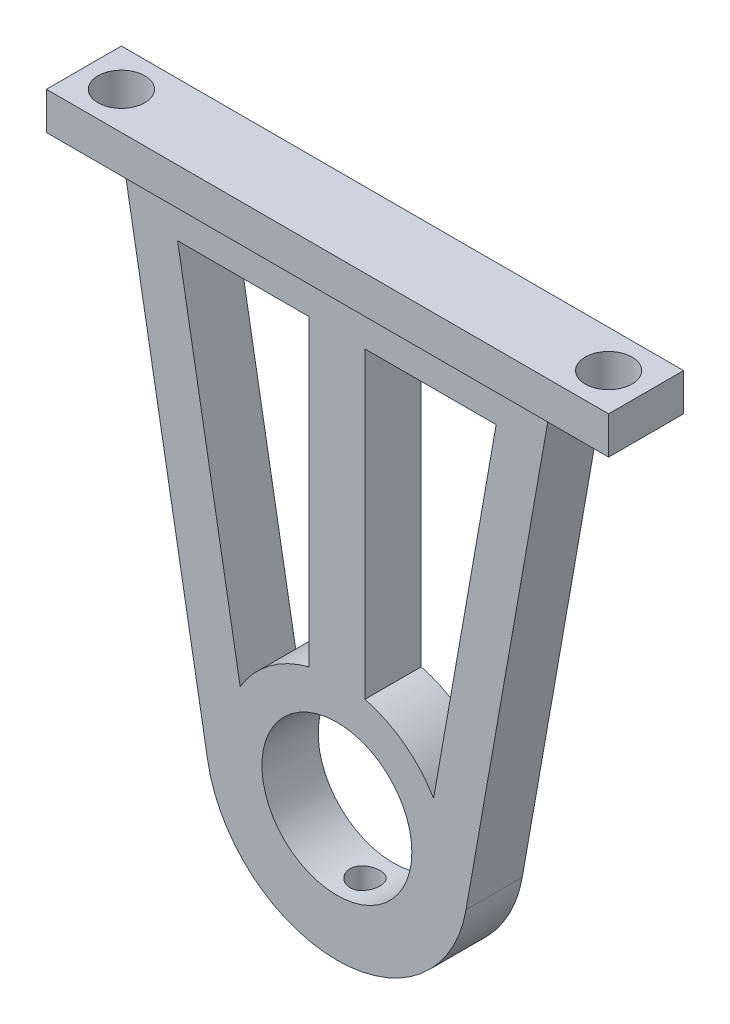
ISO-10303-21;
HEADER;
FILE_DESCRIPTION(('STEP AP214'),'2;1');
FILE_NAME('part.step','',(''),(''),'','','');
FILE_SCHEMA(('AUTOMOTIVE_DESIGN { 1 0 10303 214 1 1 1 1 }'));
ENDSEC;
DATA;
#1=APPLICATION_CONTEXT('core data for automotive mechanical design processes');
#2=APPLICATION_PROTOCOL_DEFINITION('international standard','automotive_design',2000,#1);
#3=PRODUCT_CONTEXT('',#1,'mechanical');
#4=PRODUCT('Part','Part','',(#3));
#5=PRODUCT_RELATED_PRODUCT_CATEGORY('part','',(#4));
#6=PRODUCT_DEFINITION_FORMATION('','',#4);
#7=PRODUCT_DEFINITION_CONTEXT('part definition',#1,'design');
#8=PRODUCT_DEFINITION('design','',#6,#7);
#9=PRODUCT_DEFINITION_SHAPE('','',#8);
#10=(LENGTH_UNIT() NAMED_UNIT(*) SI_UNIT(.MILLI.,.METRE.));
#11=(NAMED_UNIT(*) PLANE_ANGLE_UNIT() SI_UNIT($,.RADIAN.));
#12=(NAMED_UNIT(*) SI_UNIT($,.STERADIAN.) SOLID_ANGLE_UNIT());
#13=UNCERTAINTY_MEASURE_WITH_UNIT(LENGTH_MEASURE(1.E-05),#10,'distance_accuracy_value','');
#14=(GEOMETRIC_REPRESENTATION_CONTEXT(3) GLOBAL_UNCERTAINTY_ASSIGNED_CONTEXT((#13)) GLOBAL_UNIT_ASSIGNED_CONTEXT((#10,
#11,#12)) REPRESENTATION_CONTEXT('',''));
#15=CARTESIAN_POINT('',(0.,0.,0.));
#16=DIRECTION('',(0.,0.,1.));
#17=DIRECTION('',(1.,0.,0.));
#18=AXIS2_PLACEMENT_3D('',#15,#16,#17);
#19=CARTESIAN_POINT('',(0.,0.,1.5));
#20=DIRECTION('',(0.,0.,1.));
#21=DIRECTION('',(1.,0.,0.));
#22=AXIS2_PLACEMENT_3D('',#19,#20,#21);
#23=PLANE('',#22);
#24=DIRECTION('',(-1.,0.,0.));
#25=VECTOR('',#24,1.);
#26=CARTESIAN_POINT('',(-11.3398338202032,24.,1.5));
#27=LINE('',#26,#25);
#28=CARTESIAN_POINT('',(11.3398338202032,24.,1.5));
#29=VERTEX_POINT('',#28);
#30=CARTESIAN_POINT('',(-11.3398338202032,24.,1.5));
#31=VERTEX_POINT('',#30);
#32=EDGE_CURVE('E278',#29,#31,#27,.T.);
#33=ORIENTED_EDGE('',*,*,#32,.T.);
#34=DIRECTION('',(0.173648177666924,-0.984807753012209,0.));
#35=VECTOR('',#34,1.);
#36=CARTESIAN_POINT('',(-11.3398338202032,24.,1.5));
#37=LINE('',#36,#35);
#38=CARTESIAN_POINT('',(-6.89365427108546,-1.21553724366847,1.5));
#39=VERTEX_POINT('',#38);
#40=EDGE_CURVE('E281',#31,#39,#37,.T.);
#41=ORIENTED_EDGE('',*,*,#40,.T.);
#42=CARTESIAN_POINT('',(0.,0.,1.5));
#43=DIRECTION('',(0.,0.,1.));
#44=DIRECTION('',(1.,0.,0.));
#45=AXIS2_PLACEMENT_3D('',#42,#43,#44);
#46=CIRCLE('',#45,7.);
#47=CARTESIAN_POINT('',(6.89365427108546,-1.21553724366847,1.5));
#48=VERTEX_POINT('',#47);
#49=EDGE_CURVE('E284',#39,#48,#46,.T.);
#50=ORIENTED_EDGE('',*,*,#49,.T.);
#51=DIRECTION('',(0.173648177666924,0.984807753012209,0.));
#52=VECTOR('',#51,1.);
#53=CARTESIAN_POINT('',(11.3398338202032,24.,1.5));
#54=LINE('',#53,#52);
#55=EDGE_CURVE('E286',#48,#29,#54,.T.);
#56=ORIENTED_EDGE('',*,*,#55,.T.);
#57=EDGE_LOOP('',(#33,#41,#50,#56));
#58=FACE_BOUND('',#57,.T.);
#59=CARTESIAN_POINT('',(0.,0.,1.5));
#60=DIRECTION('',(0.,0.,1.));
#61=DIRECTION('',(1.,0.,0.));
#62=AXIS2_PLACEMENT_3D('',#59,#60,#61);
#63=CIRCLE('',#62,4.);
#64=CARTESIAN_POINT('',(4.,0.,1.5));
#65=VERTEX_POINT('',#64);
#66=EDGE_CURVE('E272',#65,#65,#63,.T.);
#67=ORIENTED_EDGE('',*,*,#66,.F.);
#68=EDGE_LOOP('',(#67));
#69=FACE_BOUND('',#68,.T.);
#70=DIRECTION('',(0.,1.,0.));
#71=VECTOR('',#70,1.);
#72=CARTESIAN_POINT('',(-1.5,0.,1.5));
#73=LINE('',#72,#71);
#74=CARTESIAN_POINT('',(-1.5,5.80947501931113,1.5));
#75=VERTEX_POINT('',#74);
#76=CARTESIAN_POINT('',(-1.5,22.,1.5));
#77=VERTEX_POINT('',#76);
#78=EDGE_CURVE('E216',#75,#77,#73,.T.);
#79=ORIENTED_EDGE('',*,*,#78,.F.);
#80=CARTESIAN_POINT('',(0.,0.,1.5));
#81=DIRECTION('',(0.,0.,1.));
#82=DIRECTION('',(1.,0.,0.));
#83=AXIS2_PLACEMENT_3D('',#80,#81,#82);
#84=CIRCLE('',#83,6.);
#85=CARTESIAN_POINT('',(-5.16052270226112,3.06088311430666,1.5));
#86=VERTEX_POINT('',#85);
#87=EDGE_CURVE('E218',#75,#86,#84,.T.);
#88=ORIENTED_EDGE('',*,*,#87,.T.);
#89=DIRECTION('',(-0.173648177666924,0.984807753012209,0.));
#90=VECTOR('',#89,1.);
#91=CARTESIAN_POINT('',(-4.48147206175791,-0.790204437779081,1.5));
#92=LINE('',#91,#90);
#93=CARTESIAN_POINT('',(-8.5,22.,1.5));
#94=VERTEX_POINT('',#93);
#95=EDGE_CURVE('E187',#86,#94,#92,.T.);
#96=ORIENTED_EDGE('',*,*,#95,.T.);
#97=DIRECTION('',(1.,0.,0.));
#98=VECTOR('',#97,1.);
#99=CARTESIAN_POINT('',(0.,22.,1.5));
#100=LINE('',#99,#98);
#101=EDGE_CURVE('E213',#94,#77,#100,.T.);
#102=ORIENTED_EDGE('',*,*,#101,.T.);
#103=EDGE_LOOP('',(#79,#88,#96,#102));
#104=FACE_BOUND('',#103,.T.);
#105=DIRECTION('',(0.173648177666924,0.984807753012209,0.));
#106=VECTOR('',#105,1.);
#107=CARTESIAN_POINT('',(4.48147206175791,-0.790204437779081,1.5));
#108=LINE('',#107,#106);
#109=CARTESIAN_POINT('',(5.16052270226112,3.06088311430666,1.5));
#110=VERTEX_POINT('',#109);
#111=CARTESIAN_POINT('',(8.5,22.,1.5));
#112=VERTEX_POINT('',#111);
#113=EDGE_CURVE('E224',#110,#112,#108,.T.);
#114=ORIENTED_EDGE('',*,*,#113,.F.);
#115=CARTESIAN_POINT('',(0.,0.,1.5));
#116=DIRECTION('',(0.,0.,1.));
#117=DIRECTION('',(1.,0.,0.));
#118=AXIS2_PLACEMENT_3D('',#115,#116,#117);
#119=CIRCLE('',#118,6.);
#120=CARTESIAN_POINT('',(1.5,5.80947501931113,1.5));
#121=VERTEX_POINT('',#120);
#122=EDGE_CURVE('E226',#110,#121,#119,.T.);
#123=ORIENTED_EDGE('',*,*,#122,.T.);
#124=DIRECTION('',(0.,1.,0.));
#125=VECTOR('',#124,1.);
#126=CARTESIAN_POINT('',(1.5,0.,1.5));
#127=LINE('',#126,#125);
#128=CARTESIAN_POINT('',(1.5,22.,1.5));
#129=VERTEX_POINT('',#128);
#130=EDGE_CURVE('E221',#121,#129,#127,.T.);
#131=ORIENTED_EDGE('',*,*,#130,.T.);
#132=DIRECTION('',(1.,0.,0.));
#133=VECTOR('',#132,1.);
#134=CARTESIAN_POINT('',(0.,22.,1.5));
#135=LINE('',#134,#133);
#136=EDGE_CURVE('E164',#129,#112,#135,.T.);
#137=ORIENTED_EDGE('',*,*,#136,.T.);
#138=EDGE_LOOP('',(#114,#123,#131,#137));
#139=FACE_BOUND('',#138,.T.);
#140=ADVANCED_FACE('F42',(#58,#69,#104,#139),#23,.T.);
#141=CARTESIAN_POINT('',(0.,0.,-1.5));
#142=DIRECTION('',(0.,0.,1.));
#143=DIRECTION('',(1.,0.,0.));
#144=AXIS2_PLACEMENT_3D('',#141,#142,#143);
#145=PLANE('',#144);
#146=CARTESIAN_POINT('',(0.,0.,-1.5));
#147=DIRECTION('',(0.,0.,-1.));
#148=DIRECTION('',(-1.,0.,0.));
#149=AXIS2_PLACEMENT_3D('',#146,#147,#148);
#150=CIRCLE('',#149,6.);
#151=CARTESIAN_POINT('',(-5.16052270226112,3.06088311430666,-1.5));
#152=VERTEX_POINT('',#151);
#153=CARTESIAN_POINT('',(-1.5,5.80947501931113,-1.5));
#154=VERTEX_POINT('',#153);
#155=EDGE_CURVE('E190',#152,#154,#150,.T.);
#156=ORIENTED_EDGE('',*,*,#155,.T.);
#157=DIRECTION('',(0.,-1.,0.));
#158=VECTOR('',#157,1.);
#159=CARTESIAN_POINT('',(-1.5,0.,-1.5));
#160=LINE('',#159,#158);
#161=CARTESIAN_POINT('',(-1.5,22.,-1.5));
#162=VERTEX_POINT('',#161);
#163=EDGE_CURVE('E200',#162,#154,#160,.T.);
#164=ORIENTED_EDGE('',*,*,#163,.F.);
#165=DIRECTION('',(-1.,0.,0.));
#166=VECTOR('',#165,1.);
#167=CARTESIAN_POINT('',(0.,22.,-1.5));
#168=LINE('',#167,#166);
#169=CARTESIAN_POINT('',(-8.5,22.,-1.5));
#170=VERTEX_POINT('',#169);
#171=EDGE_CURVE('E197',#162,#170,#168,.T.);
#172=ORIENTED_EDGE('',*,*,#171,.T.);
#173=DIRECTION('',(0.173648177666924,-0.984807753012209,0.));
#174=VECTOR('',#173,1.);
#175=CARTESIAN_POINT('',(-4.48147206175791,-0.790204437779081,-1.5));
#176=LINE('',#175,#174);
#177=EDGE_CURVE('E193',#170,#152,#176,.T.);
#178=ORIENTED_EDGE('',*,*,#177,.T.);
#179=EDGE_LOOP('',(#156,#164,#172,#178));
#180=FACE_BOUND('',#179,.T.);
#181=DIRECTION('',(-1.,0.,0.));
#182=VECTOR('',#181,1.);
#183=CARTESIAN_POINT('',(-11.3398338202032,24.,-1.5));
#184=LINE('',#183,#182);
#185=CARTESIAN_POINT('',(11.3398338202032,24.,-1.5));
#186=VERTEX_POINT('',#185);
#187=CARTESIAN_POINT('',(-11.3398338202032,24.,-1.5));
#188=VERTEX_POINT('',#187);
#189=EDGE_CURVE('E275',#186,#188,#184,.T.);
#190=ORIENTED_EDGE('',*,*,#189,.F.);
#191=DIRECTION('',(0.173648177666924,0.984807753012209,0.));
#192=VECTOR('',#191,1.);
#193=CARTESIAN_POINT('',(11.3398338202032,24.,-1.5));
#194=LINE('',#193,#192);
#195=CARTESIAN_POINT('',(6.89365427108546,-1.21553724366847,-1.5));
#196=VERTEX_POINT('',#195);
#197=EDGE_CURVE('E282',#196,#186,#194,.T.);
#198=ORIENTED_EDGE('',*,*,#197,.F.);
#199=CARTESIAN_POINT('',(0.,0.,-1.5));
#200=DIRECTION('',(0.,0.,1.));
#201=DIRECTION('',(1.,0.,0.));
#202=AXIS2_PLACEMENT_3D('',#199,#200,#201);
#203=CIRCLE('',#202,7.);
#204=CARTESIAN_POINT('',(-6.89365427108546,-1.21553724366847,-1.5));
#205=VERTEX_POINT('',#204);
#206=EDGE_CURVE('E293',#205,#196,#203,.T.);
#207=ORIENTED_EDGE('',*,*,#206,.F.);
#208=DIRECTION('',(0.173648177666924,-0.984807753012209,0.));
#209=VECTOR('',#208,1.);
#210=CARTESIAN_POINT('',(-11.3398338202032,24.,-1.5));
#211=LINE('',#210,#209);
#212=EDGE_CURVE('E291',#188,#205,#211,.T.);
#213=ORIENTED_EDGE('',*,*,#212,.F.);
#214=EDGE_LOOP('',(#190,#198,#207,#213));
#215=FACE_BOUND('',#214,.T.);
#216=CARTESIAN_POINT('',(0.,0.,-1.5));
#217=DIRECTION('',(0.,0.,1.));
#218=DIRECTION('',(1.,0.,0.));
#219=AXIS2_PLACEMENT_3D('',#216,#217,#218);
#220=CIRCLE('',#219,4.);
#221=CARTESIAN_POINT('',(4.,0.,-1.5));
#222=VERTEX_POINT('',#221);
#223=EDGE_CURVE('E271',#222,#222,#220,.T.);
#224=ORIENTED_EDGE('',*,*,#223,.T.);
#225=EDGE_LOOP('',(#224));
#226=FACE_BOUND('',#225,.T.);
#227=CARTESIAN_POINT('',(0.,0.,-1.5));
#228=DIRECTION('',(0.,0.,-1.));
#229=DIRECTION('',(-1.,0.,0.));
#230=AXIS2_PLACEMENT_3D('',#227,#228,#229);
#231=CIRCLE('',#230,6.);
#232=CARTESIAN_POINT('',(1.5,5.80947501931113,-1.5));
#233=VERTEX_POINT('',#232);
#234=CARTESIAN_POINT('',(5.16052270226112,3.06088311430666,-1.5));
#235=VERTEX_POINT('',#234);
#236=EDGE_CURVE('E176',#233,#235,#231,.T.);
#237=ORIENTED_EDGE('',*,*,#236,.T.);
#238=DIRECTION('',(-0.173648177666924,-0.984807753012209,0.));
#239=VECTOR('',#238,1.);
#240=CARTESIAN_POINT('',(4.48147206175791,-0.790204437779081,-1.5));
#241=LINE('',#240,#239);
#242=CARTESIAN_POINT('',(8.5,22.,-1.5));
#243=VERTEX_POINT('',#242);
#244=EDGE_CURVE('E180',#243,#235,#241,.T.);
#245=ORIENTED_EDGE('',*,*,#244,.F.);
#246=DIRECTION('',(-1.,0.,0.));
#247=VECTOR('',#246,1.);
#248=CARTESIAN_POINT('',(0.,22.,-1.5));
#249=LINE('',#248,#247);
#250=CARTESIAN_POINT('',(1.5,22.,-1.5));
#251=VERTEX_POINT('',#250);
#252=EDGE_CURVE('E161',#243,#251,#249,.T.);
#253=ORIENTED_EDGE('',*,*,#252,.T.);
#254=DIRECTION('',(0.,-1.,0.));
#255=VECTOR('',#254,1.);
#256=CARTESIAN_POINT('',(1.5,0.,-1.5));
#257=LINE('',#256,#255);
#258=EDGE_CURVE('E171',#251,#233,#257,.T.);
#259=ORIENTED_EDGE('',*,*,#258,.T.);
#260=EDGE_LOOP('',(#237,#245,#253,#259));
#261=FACE_BOUND('',#260,.T.);
#262=ADVANCED_FACE('F178',(#180,#215,#226,#261),#145,.F.);
#263=CARTESIAN_POINT('',(-11.3398338202032,24.,1.5));
#264=DIRECTION('',(0.984807753012209,0.173648177666924,0.));
#265=DIRECTION('',(-0.173648177666924,0.984807753012209,0.));
#266=AXIS2_PLACEMENT_3D('',#263,#264,#265);
#267=PLANE('',#266);
#268=ORIENTED_EDGE('',*,*,#212,.T.);
#269=DIRECTION('',(0.,0.,-1.));
#270=VECTOR('',#269,1.);
#271=CARTESIAN_POINT('',(-6.89365427108546,-1.21553724366847,1.5));
#272=LINE('',#271,#270);
#273=EDGE_CURVE('E302',#39,#205,#272,.T.);
#274=ORIENTED_EDGE('',*,*,#273,.F.);
#275=ORIENTED_EDGE('',*,*,#40,.F.);
#276=DIRECTION('',(0.,0.,-1.));
#277=VECTOR('',#276,1.);
#278=CARTESIAN_POINT('',(-11.3398338202032,24.,1.5));
#279=LINE('',#278,#277);
#280=EDGE_CURVE('E54',#31,#188,#279,.T.);
#281=ORIENTED_EDGE('',*,*,#280,.T.);
#282=EDGE_LOOP('',(#268,#274,#275,#281));
#283=FACE_BOUND('',#282,.T.);
#284=ADVANCED_FACE('F44',(#283),#267,.F.);
#285=CARTESIAN_POINT('',(0.,0.,1.5));
#286=DIRECTION('',(0.,0.,-1.));
#287=DIRECTION('',(-1.,0.,0.));
#288=AXIS2_PLACEMENT_3D('',#285,#286,#287);
#289=CYLINDRICAL_SURFACE('',#288,7.);
#290=CARTESIAN_POINT('',(0.,-7.,-0.799999999999999));
#291=CARTESIAN_POINT('',(-0.0447797124525085,-6.99999942042729,-0.799998079888882));
#292=CARTESIAN_POINT('',(-0.089588148113667,-6.99956575867833,-0.796227538765317));
#293=CARTESIAN_POINT('',(-0.177960249033293,-6.99787750310771,-0.781244445733806));
#294=CARTESIAN_POINT('',(-0.221522529769561,-6.99662203057992,-0.770023927890424));
#295=CARTESIAN_POINT('',(-0.306109998284851,-6.99343171898029,-0.740473975817106));
#296=CARTESIAN_POINT('',(-0.347136794677778,-6.99149731596308,-0.722149103691062));
#297=CARTESIAN_POINT('',(-0.425524240944705,-6.9871648132702,-0.678920103715913));
#298=CARTESIAN_POINT('',(-0.462885563389012,-6.98476679890242,-0.654017185966938));
#299=CARTESIAN_POINT('',(-0.533063134059106,-6.97976277536196,-0.598215310517044));
#300=CARTESIAN_POINT('',(-0.56585995064833,-6.97715594717355,-0.567291986248195));
#301=CARTESIAN_POINT('',(-0.625810318319877,-6.97203478104782,-0.500379297465931));
#302=CARTESIAN_POINT('',(-0.652963594281899,-6.96952044762451,-0.464389686116474));
#303=CARTESIAN_POINT('',(-0.700927001871668,-6.9648607826455,-0.388241693016384));
#304=CARTESIAN_POINT('',(-0.721719189064304,-6.96271650228225,-0.348071938734393));
#305=CARTESIAN_POINT('',(-0.756255621643103,-6.95905028435061,-0.264782415027381));
#306=CARTESIAN_POINT('',(-0.770000091568157,-6.95752832695545,-0.221662739635883));
#307=CARTESIAN_POINT('',(-0.789992482406421,-6.95528674267645,-0.133897674718194));
#308=CARTESIAN_POINT('',(-0.796272982524775,-6.9545636299271,-0.0892597971094674));
#309=CARTESIAN_POINT('',(-0.801259918556064,-6.95399088282306,0.0004418373668221));
#310=CARTESIAN_POINT('',(-0.799966610848563,-6.95414121890142,0.0455055797669596));
#311=CARTESIAN_POINT('',(-0.789869435113039,-6.95529519507513,0.134553830780454));
#312=CARTESIAN_POINT('',(-0.781101309720024,-6.95629477423364,0.17854245231685));
#313=CARTESIAN_POINT('',(-0.756359091448456,-6.95902827332338,0.264419752439361));
#314=CARTESIAN_POINT('',(-0.74038487459266,-6.96076220588876,0.306308394882596));
#315=CARTESIAN_POINT('',(-0.701645034762517,-6.96477368088015,0.386908563625307));
#316=CARTESIAN_POINT('',(-0.6788637316216,-6.96705247595229,0.425612488492518));
#317=CARTESIAN_POINT('',(-0.627167635655839,-6.97189590867034,0.498661317097488));
#318=CARTESIAN_POINT('',(-0.598252608204628,-6.97446055724888,0.53300605400785));
#319=CARTESIAN_POINT('',(-0.534911064402817,-6.97960480367265,0.596569156677092));
#320=CARTESIAN_POINT('',(-0.500453712194195,-6.98218440239837,0.625756802790695));
#321=CARTESIAN_POINT('',(-0.427112217378578,-6.9870539965681,0.677938501448738));
#322=CARTESIAN_POINT('',(-0.388228067205249,-6.9893439915171,0.70093254340677));
#323=CARTESIAN_POINT('',(-0.30711415996368,-6.9933774598393,0.740073767194995));
#324=CARTESIAN_POINT('',(-0.264883547559042,-6.99512079292081,0.756219191815529));
#325=CARTESIAN_POINT('',(-0.178286402222369,-6.99786317748364,0.781181340129565));
#326=CARTESIAN_POINT('',(-0.133919952871148,-6.9988622580643,0.789998350356616));
#327=CARTESIAN_POINT('',(-0.0445763388756573,-6.99999980785433,0.800013956776737));
#328=CARTESIAN_POINT('',(0.000396019705553535,-7.0001430611105,0.801254903771625));
#329=CARTESIAN_POINT('',(0.0899080572858109,-6.99956569206305,0.796194680309447));
#330=CARTESIAN_POINT('',(0.134447743943705,-6.99884508507905,0.789893643601305));
#331=CARTESIAN_POINT('',(0.221706397775416,-6.99662397582782,0.76996347856176));
#332=CARTESIAN_POINT('',(0.264429998286159,-6.99512560542336,0.756354378253585));
#333=CARTESIAN_POINT('',(0.346988242618616,-6.99151686999577,0.722215111049346));
#334=CARTESIAN_POINT('',(0.38682280320257,-6.98940648734835,0.701684744836962));
#335=CARTESIAN_POINT('',(0.462662422279519,-6.98479742187624,0.654182095734105));
#336=CARTESIAN_POINT('',(0.498650096992434,-6.98229709238882,0.627182221475493));
#337=CARTESIAN_POINT('',(0.565597930747979,-6.97719344762217,0.567546256237686));
#338=CARTESIAN_POINT('',(0.596557923895019,-6.97459012894819,0.534909979350564));
#339=CARTESIAN_POINT('',(0.652720357149333,-6.96955931861943,0.464741870239327));
#340=CARTESIAN_POINT('',(0.67789484886262,-6.9671327176158,0.427187595147739));
#341=CARTESIAN_POINT('',(0.721579023768417,-6.96274426970974,0.348359231179872));
#342=CARTESIAN_POINT('',(0.740088821680848,-6.96078241480778,0.307085206347244));
#343=CARTESIAN_POINT('',(0.769872230798422,-6.95755145149974,0.222081714894093));
#344=CARTESIAN_POINT('',(0.781161995365959,-6.95628079763046,0.178357969284183));
#345=CARTESIAN_POINT('',(0.796237069656474,-6.95457151966547,0.0896199956298923));
#346=CARTESIAN_POINT('',(0.800022666982631,-6.9541328636828,0.0446058171094614));
#347=CARTESIAN_POINT('',(0.79997725874822,-6.9541380654956,-0.0451573230555469));
#348=CARTESIAN_POINT('',(0.796190156402063,-6.95457683635341,-0.0899063136092229));
#349=CARTESIAN_POINT('',(0.781199403506914,-6.95627655873122,-0.17812759523522));
#350=CARTESIAN_POINT('',(0.769995748395899,-6.95753751075695,-0.221599885522208));
#351=CARTESIAN_POINT('',(0.740502932027409,-6.9607380195391,-0.3060304173449));
#352=CARTESIAN_POINT('',(0.722215516354274,-6.96267740910316,-0.346989275363816));
#353=CARTESIAN_POINT('',(0.679078665570716,-6.96701657959246,-0.425263672642495));
#354=CARTESIAN_POINT('',(0.654229201974267,-6.96941636251627,-0.462579196085481));
#355=CARTESIAN_POINT('',(0.598509710447598,-6.97442260733129,-0.532732453450445));
#356=CARTESIAN_POINT('',(0.567606934405896,-6.97703014548633,-0.56554410156222));
#357=CARTESIAN_POINT('',(0.500725246052354,-6.98214842458322,-0.625533709576058));
#358=CARTESIAN_POINT('',(0.464745130524452,-6.98465914240072,-0.652710330321954));
#359=CARTESIAN_POINT('',(0.388600068220046,-6.98930958447243,-0.700730468932407));
#360=CARTESIAN_POINT('',(0.348422077665915,-6.99144809380597,-0.721553408427048));
#361=CARTESIAN_POINT('',(0.265139175758719,-6.99510053709553,-0.756128084846078));
#362=CARTESIAN_POINT('',(0.222037559539484,-6.99661516102712,-0.769887637575888));
#363=CARTESIAN_POINT('',(0.148919234277058,-6.99847697916734,-0.786588440906047));
#364=CARTESIAN_POINT('',(0.119366652364129,-6.99904538421363,-0.791610711502455));
#365=CARTESIAN_POINT('',(0.0598803274640744,-6.9998070873376,-0.798317123407872));
#366=CARTESIAN_POINT('',(0.0299465866890254,-7.00000038759123,-0.800001284080911));
#367=CARTESIAN_POINT('',(0.,-7.,-0.799999999999999));
#368=B_SPLINE_CURVE_WITH_KNOTS('',3,(#290,#291,#292,#293,#294,#295,#296,#297,#298,#299,#300,
#301,#302,#303,#304,#305,#306,#307,#308,#309,#310,#311,#312,#313,#314,#315,#316,#317,#318,#319,
#320,#321,#322,#323,#324,#325,#326,#327,#328,#329,#330,#331,#332,#333,#334,#335,#336,#337,#338,
#339,#340,#341,#342,#343,#344,#345,#346,#347,#348,#349,#350,#351,#352,#353,#354,#355,#356,#357,
#358,#359,#360,#361,#362,#363,#364,#365,#366,#367),.UNSPECIFIED.,.T.,.F.,(4,2,2,2,2,2,2,2,2,2,2,
2,2,2,2,2,2,2,2,2,2,2,2,2,2,2,2,2,2,2,2,2,2,2,2,2,2,2,4),(0.,0.134229766665712,
0.268603291007328,0.402890669126482,0.53715336086479,0.671971199579504,0.806795609068051,
0.941996919719077,1.07719392261521,1.211798616009,1.34639875295063,1.48035885409296,
1.6143212600405,1.74859465987512,1.88287319684356,2.01792644919159,2.15297993237768,
2.2880680464879,2.42315087854179,2.55747789011733,2.69180251958391,2.82576089213565,
2.95972312270572,3.09426718034224,3.22881567655199,3.36400108756318,3.49918417150551,
3.63406374271913,3.76893814446593,3.90303287028735,4.03712767859233,4.17118946417728,
4.3052518317376,4.44006056538321,4.57490129950477,4.71017423167025,4.84529715671566,
4.93506429548788,5.02483091352871),.UNSPECIFIED.);
#369=CARTESIAN_POINT('',(0.,-7.,-0.799999999999999));
#370=VERTEX_POINT('',#369);
#371=EDGE_CURVE('E11',#370,#370,#368,.T.);
#372=ORIENTED_EDGE('',*,*,#371,.T.);
#373=EDGE_LOOP('',(#372));
#374=FACE_BOUND('',#373,.T.);
#375=ORIENTED_EDGE('',*,*,#206,.T.);
#376=DIRECTION('',(0.,0.,-1.));
#377=VECTOR('',#376,1.);
#378=CARTESIAN_POINT('',(6.89365427108546,-1.21553724366847,1.5));
#379=LINE('',#378,#377);
#380=EDGE_CURVE('E299',#48,#196,#379,.T.);
#381=ORIENTED_EDGE('',*,*,#380,.F.);
#382=ORIENTED_EDGE('',*,*,#49,.F.);
#383=ORIENTED_EDGE('',*,*,#273,.T.);
#384=EDGE_LOOP('',(#375,#381,#382,#383));
#385=FACE_BOUND('',#384,.T.);
#386=ADVANCED_FACE('F322',(#374,#385),#289,.T.);
#387=CARTESIAN_POINT('',(11.3398338202032,24.,1.5));
#388=DIRECTION('',(-0.984807753012209,0.173648177666924,0.));
#389=DIRECTION('',(-0.173648177666924,-0.984807753012209,0.));
#390=AXIS2_PLACEMENT_3D('',#387,#388,#389);
#391=PLANE('',#390);
#392=ORIENTED_EDGE('',*,*,#197,.T.);
#393=DIRECTION('',(0.,0.,-1.));
#394=VECTOR('',#393,1.);
#395=CARTESIAN_POINT('',(11.3398338202032,24.,1.5));
#396=LINE('',#395,#394);
#397=EDGE_CURVE('E288',#29,#186,#396,.T.);
#398=ORIENTED_EDGE('',*,*,#397,.F.);
#399=ORIENTED_EDGE('',*,*,#55,.F.);
#400=ORIENTED_EDGE('',*,*,#380,.T.);
#401=EDGE_LOOP('',(#392,#398,#399,#400));
#402=FACE_BOUND('',#401,.T.);
#403=ADVANCED_FACE('F317',(#402),#391,.F.);
#404=CARTESIAN_POINT('',(0.,0.,1.5));
#405=DIRECTION('',(0.,0.,-1.));
#406=DIRECTION('',(-1.,0.,0.));
#407=AXIS2_PLACEMENT_3D('',#404,#405,#406);
#408=CYLINDRICAL_SURFACE('',#407,4.);
#409=CARTESIAN_POINT('',(0.,-4.,-0.799999999999999));
#410=CARTESIAN_POINT('',(-0.0444615254341065,-3.99999918064697,-0.799998364401323));
#411=CARTESIAN_POINT('',(-0.0889437281612178,-3.99925108142585,-0.796280925625883));
#412=CARTESIAN_POINT('',(-0.176650806151215,-3.99633892498585,-0.781521199907803));
#413=CARTESIAN_POINT('',(-0.219874654033084,-3.99417374288149,-0.770473093758791));
#414=CARTESIAN_POINT('',(-0.30378424421065,-3.98866919422629,-0.741406981103368));
#415=CARTESIAN_POINT('',(-0.344472374346507,-3.98533095261374,-0.723395650524249));
#416=CARTESIAN_POINT('',(-0.42224639109138,-3.97784318428251,-0.680934201990964));
#417=CARTESIAN_POINT('',(-0.459332492060649,-3.97369370588566,-0.656484467514235));
#418=CARTESIAN_POINT('',(-0.529354781851891,-3.96497732263976,-0.601489204566852));
#419=CARTESIAN_POINT('',(-0.562235160926819,-3.96040596403478,-0.570873315687037));
#420=CARTESIAN_POINT('',(-0.622429405286422,-3.95139344362071,-0.504566066886637));
#421=CARTESIAN_POINT('',(-0.649742835816339,-3.94695229200339,-0.468874310931904));
#422=CARTESIAN_POINT('',(-0.698265402678095,-3.93865953450092,-0.393027045590499));
#423=CARTESIAN_POINT('',(-0.719416751092692,-3.93481365891957,-0.352833884962912));
#424=CARTESIAN_POINT('',(-0.754644533264246,-3.92821014446734,-0.269374544796736));
#425=CARTESIAN_POINT('',(-0.768721665949789,-3.92545239809569,-0.226108669322924));
#426=CARTESIAN_POINT('',(-0.789220239907861,-3.92138244201764,-0.138332508873666));
#427=CARTESIAN_POINT('',(-0.795739598367021,-3.9200517608575,-0.0938459646862189));
#428=CARTESIAN_POINT('',(-0.801241702180894,-3.91893100048502,-0.00439214290852606));
#429=CARTESIAN_POINT('',(-0.800225218170799,-3.91914076374273,0.0405750850561162));
#430=CARTESIAN_POINT('',(-0.790763658481454,-3.92106040918548,0.128997430416802));
#431=CARTESIAN_POINT('',(-0.782430832195123,-3.92274762287011,0.172465124501851));
#432=CARTESIAN_POINT('',(-0.75875030769844,-3.92739636928001,0.257372861330401));
#433=CARTESIAN_POINT('',(-0.743402274480544,-3.93035796286223,0.298812807135206));
#434=CARTESIAN_POINT('',(-0.706019826939775,-3.93724494800326,0.378812209362879));
#435=CARTESIAN_POINT('',(-0.68394092098569,-3.94117671850963,0.417350303655337));
#436=CARTESIAN_POINT('',(-0.633754859658142,-3.9495569501845,0.490216679978251));
#437=CARTESIAN_POINT('',(-0.605647011485462,-3.95400547070693,0.524544477480925));
#438=CARTESIAN_POINT('',(-0.543599947648467,-3.96301616993169,0.588663521965548));
#439=CARTESIAN_POINT('',(-0.509564928969955,-3.96757895368724,0.618362054287303));
#440=CARTESIAN_POINT('',(-0.436948019249607,-3.97623078971527,0.671643077040979));
#441=CARTESIAN_POINT('',(-0.398366069903511,-3.98031983591179,0.695225489034862));
#442=CARTESIAN_POINT('',(-0.317647509503136,-3.9875735212871,0.735622007380779));
#443=CARTESIAN_POINT('',(-0.27550545566824,-3.99073671078617,0.752425514915629));
#444=CARTESIAN_POINT('',(-0.188919181158931,-3.99577127190287,0.778688379230852));
#445=CARTESIAN_POINT('',(-0.144475240057959,-3.99764280000425,0.788148625658901));
#446=CARTESIAN_POINT('',(-0.05534352450172,-3.99986137493494,0.799325163035421));
#447=CARTESIAN_POINT('',(-0.0106722626604608,-4.00023339721976,0.801168335632214));
#448=CARTESIAN_POINT('',(0.0783399473541714,-3.99948041544082,0.797400112846254));
#449=CARTESIAN_POINT('',(0.122680913955035,-3.99835549553157,0.791789136517922));
#450=CARTESIAN_POINT('',(0.209364527957233,-3.99475065606414,0.773377301164834));
#451=CARTESIAN_POINT('',(0.251721558671923,-3.99228301123365,0.760641545201677));
#452=CARTESIAN_POINT('',(0.333698901999734,-3.98626841648826,0.728412813875352));
#453=CARTESIAN_POINT('',(0.373319009310031,-3.98272138571381,0.708919332258535));
#454=CARTESIAN_POINT('',(0.449232938948974,-3.97487929226636,0.663454007478949));
#455=CARTESIAN_POINT('',(0.48548010140175,-3.97057560349641,0.637405775168843));
#456=CARTESIAN_POINT('',(0.553134415295365,-3.96171787863906,0.579672647034174));
#457=CARTESIAN_POINT('',(0.58454104714461,-3.9571638157471,0.547987146880106));
#458=CARTESIAN_POINT('',(0.64211247261934,-3.94823442845572,0.4793013184871));
#459=CARTESIAN_POINT('',(0.668190161958924,-3.94386288186643,0.442227404622929));
#460=CARTESIAN_POINT('',(0.713748336040964,-3.93587353436955,0.364150910914656));
#461=CARTESIAN_POINT('',(0.733229084738321,-3.93225570330674,0.323148488341157));
#462=CARTESIAN_POINT('',(0.764921473265567,-3.92621392467506,0.23858540308036));
#463=CARTESIAN_POINT('',(0.77717079983284,-3.92378379897749,0.195039327031744));
#464=CARTESIAN_POINT('',(0.794166921301756,-3.9203794943362,0.106453237207275));
#465=CARTESIAN_POINT('',(0.798914694580089,-3.91940512552889,0.0614134190325215));
#466=CARTESIAN_POINT('',(0.800736728693974,-3.91903319705103,-0.0280070916354554));
#467=CARTESIAN_POINT('',(0.797948630456716,-3.91960735351441,-0.0723849191416079));
#468=CARTESIAN_POINT('',(0.785081843280047,-3.92220458787691,-0.160025319924021));
#469=CARTESIAN_POINT('',(0.775003212903438,-3.92422765413735,-0.203287902155844));
#470=CARTESIAN_POINT('',(0.747902854799162,-3.92948211375327,-0.287382168992436));
#471=CARTESIAN_POINT('',(0.730898005373875,-3.93271056815064,-0.328219488401932));
#472=CARTESIAN_POINT('',(0.690443715681282,-3.94001371979336,-0.406482976587553));
#473=CARTESIAN_POINT('',(0.666993735019905,-3.94408848799115,-0.44390885898011));
#474=CARTESIAN_POINT('',(0.61384473182913,-3.9527116841858,-0.514972457720251));
#475=CARTESIAN_POINT('',(0.584046309788144,-3.9572669832776,-0.548535012214076));
#476=CARTESIAN_POINT('',(0.519251495210512,-3.96628865497564,-0.610228964423336));
#477=CARTESIAN_POINT('',(0.484253909722667,-3.97075500690548,-0.638359112253817));
#478=CARTESIAN_POINT('',(0.409614103270596,-3.97915065910377,-0.688667715157157));
#479=CARTESIAN_POINT('',(0.369927107543867,-3.98307384975397,-0.710780802624019));
#480=CARTESIAN_POINT('',(0.287333088752585,-3.98988100068,-0.747988898077273));
#481=CARTESIAN_POINT('',(0.2444290086905,-3.99276589710893,-0.763090231625993));
#482=CARTESIAN_POINT('',(0.167857191139023,-3.99661098076296,-0.782921558435772));
#483=CARTESIAN_POINT('',(0.134625331211027,-3.99787442526761,-0.789314554966205));
#484=CARTESIAN_POINT('',(0.0675996201680534,-3.99956923311914,-0.79785432988669));
#485=CARTESIAN_POINT('',(0.0338057869988951,-4.00000062298524,-0.800001243607813));
#486=CARTESIAN_POINT('',(0.,-4.,-0.799999999999999));
#487=B_SPLINE_CURVE_WITH_KNOTS('',3,(#409,#410,#411,#412,#413,#414,#415,#416,#417,#418,#419,
#420,#421,#422,#423,#424,#425,#426,#427,#428,#429,#430,#431,#432,#433,#434,#435,#436,#437,#438,
#439,#440,#441,#442,#443,#444,#445,#446,#447,#448,#449,#450,#451,#452,#453,#454,#455,#456,#457,
#458,#459,#460,#461,#462,#463,#464,#465,#466,#467,#468,#469,#470,#471,#472,#473,#474,#475,#476,
#477,#478,#479,#480,#481,#482,#483,#484,#485,#486),.UNSPECIFIED.,.T.,.F.,(4,2,2,2,2,2,2,2,2,2,2,
2,2,2,2,2,2,2,2,2,2,2,2,2,2,2,2,2,2,2,2,2,2,2,2,2,2,2,4),(0.,0.133260904529007,
0.266627720553058,0.399866988200273,0.53309832178469,0.667946136089748,0.802804477397892,
0.938889560047381,1.07496119492158,1.2092494808287,1.3435240342498,1.47577381605022,
1.60802991402984,1.74117992162874,1.87434523799736,2.0099060199308,2.14546854031856,
2.28124219883219,2.41699940558428,2.55048588541012,2.68396486126294,2.81624363160578,
2.94853231372818,3.08244052826687,3.21636310676744,3.3523250286338,3.48828150978773,
3.62352304826178,3.75874694664331,3.89151778054161,4.02428754794086,4.15673569002487,
4.28919494065493,4.42390460991314,4.55864523626344,4.69479597340509,4.83082364414014,
4.93215020231915,5.03347353096796),.UNSPECIFIED.);
#488=CARTESIAN_POINT('',(0.,-4.,-0.799999999999999));
#489=VERTEX_POINT('',#488);
#490=EDGE_CURVE('E194',#489,#489,#487,.T.);
#491=ORIENTED_EDGE('',*,*,#490,.F.);
#492=EDGE_LOOP('',(#491));
#493=FACE_BOUND('',#492,.T.);
#494=ORIENTED_EDGE('',*,*,#66,.T.);
#495=EDGE_LOOP('',(#494));
#496=FACE_BOUND('',#495,.T.);
#497=ORIENTED_EDGE('',*,*,#223,.F.);
#498=EDGE_LOOP('',(#497));
#499=FACE_BOUND('',#498,.T.);
#500=ADVANCED_FACE('F343',(#493,#496,#499),#408,.F.);
#501=CARTESIAN_POINT('',(0.,24.,0.));
#502=DIRECTION('',(0.,1.,0.));
#503=DIRECTION('',(0.,0.,1.));
#504=AXIS2_PLACEMENT_3D('',#501,#502,#503);
#505=PLANE('',#504);
#506=CARTESIAN_POINT('',(-13.,24.,0.));
#507=DIRECTION('',(0.,1.,0.));
#508=DIRECTION('',(0.,0.,1.));
#509=AXIS2_PLACEMENT_3D('',#506,#507,#508);
#510=CIRCLE('',#509,1.25);
#511=CARTESIAN_POINT('',(-13.,24.,1.25));
#512=VERTEX_POINT('',#511);
#513=EDGE_CURVE('E232',#512,#512,#510,.T.);
#514=ORIENTED_EDGE('',*,*,#513,.T.);
#515=EDGE_LOOP('',(#514));
#516=FACE_BOUND('',#515,.T.);
#517=CARTESIAN_POINT('',(13.,24.,0.));
#518=DIRECTION('',(0.,1.,0.));
#519=DIRECTION('',(0.,0.,1.));
#520=AXIS2_PLACEMENT_3D('',#517,#518,#519);
#521=CIRCLE('',#520,1.25);
#522=CARTESIAN_POINT('',(13.,24.,1.24999999999999));
#523=VERTEX_POINT('',#522);
#524=EDGE_CURVE('E238',#523,#523,#521,.T.);
#525=ORIENTED_EDGE('',*,*,#524,.T.);
#526=EDGE_LOOP('',(#525));
#527=FACE_BOUND('',#526,.T.);
#528=DIRECTION('',(0.,0.,1.));
#529=VECTOR('',#528,1.);
#530=CARTESIAN_POINT('',(-15.,24.,2.));
#531=LINE('',#530,#529);
#532=CARTESIAN_POINT('',(-15.,24.,-2.));
#533=VERTEX_POINT('',#532);
#534=CARTESIAN_POINT('',(-15.,24.,2.));
#535=VERTEX_POINT('',#534);
#536=EDGE_CURVE('E241',#533,#535,#531,.T.);
#537=ORIENTED_EDGE('',*,*,#536,.F.);
#538=DIRECTION('',(-1.,0.,0.));
#539=VECTOR('',#538,1.);
#540=CARTESIAN_POINT('',(15.,24.,-2.));
#541=LINE('',#540,#539);
#542=CARTESIAN_POINT('',(15.,24.,-2.));
#543=VERTEX_POINT('',#542);
#544=EDGE_CURVE('E246',#543,#533,#541,.T.);
#545=ORIENTED_EDGE('',*,*,#544,.F.);
#546=DIRECTION('',(0.,0.,-1.));
#547=VECTOR('',#546,1.);
#548=CARTESIAN_POINT('',(15.,24.,2.));
#549=LINE('',#548,#547);
#550=CARTESIAN_POINT('',(15.,24.,2.));
#551=VERTEX_POINT('',#550);
#552=EDGE_CURVE('E257',#551,#543,#549,.T.);
#553=ORIENTED_EDGE('',*,*,#552,.F.);
#554=DIRECTION('',(1.,0.,0.));
#555=VECTOR('',#554,1.);
#556=CARTESIAN_POINT('',(15.,24.,2.));
#557=LINE('',#556,#555);
#558=EDGE_CURVE('E255',#535,#551,#557,.T.);
#559=ORIENTED_EDGE('',*,*,#558,.F.);
#560=EDGE_LOOP('',(#537,#545,#553,#559));
#561=FACE_BOUND('',#560,.T.);
#562=ORIENTED_EDGE('',*,*,#397,.T.);
#563=ORIENTED_EDGE('',*,*,#189,.T.);
#564=ORIENTED_EDGE('',*,*,#280,.F.);
#565=ORIENTED_EDGE('',*,*,#32,.F.);
#566=EDGE_LOOP('',(#562,#563,#564,#565));
#567=FACE_BOUND('',#566,.T.);
#568=ADVANCED_FACE('F310',(#516,#527,#561,#567),#505,.F.);
#569=CARTESIAN_POINT('',(-15.,26.,2.));
#570=DIRECTION('',(1.,0.,0.));
#571=DIRECTION('',(0.,0.,-1.));
#572=AXIS2_PLACEMENT_3D('',#569,#570,#571);
#573=PLANE('',#572);
#574=ORIENTED_EDGE('',*,*,#536,.T.);
#575=DIRECTION('',(0.,-1.,0.));
#576=VECTOR('',#575,1.);
#577=CARTESIAN_POINT('',(-15.,26.,2.));
#578=LINE('',#577,#576);
#579=CARTESIAN_POINT('',(-15.,26.,2.));
#580=VERTEX_POINT('',#579);
#581=EDGE_CURVE('E268',#580,#535,#578,.T.);
#582=ORIENTED_EDGE('',*,*,#581,.F.);
#583=DIRECTION('',(0.,0.,1.));
#584=VECTOR('',#583,1.);
#585=CARTESIAN_POINT('',(-15.,26.,2.));
#586=LINE('',#585,#584);
#587=CARTESIAN_POINT('',(-15.,26.,-2.));
#588=VERTEX_POINT('',#587);
#589=EDGE_CURVE('E242',#588,#580,#586,.T.);
#590=ORIENTED_EDGE('',*,*,#589,.F.);
#591=DIRECTION('',(0.,-1.,0.));
#592=VECTOR('',#591,1.);
#593=CARTESIAN_POINT('',(-15.,26.,-2.));
#594=LINE('',#593,#592);
#595=EDGE_CURVE('E252',#588,#533,#594,.T.);
#596=ORIENTED_EDGE('',*,*,#595,.T.);
#597=EDGE_LOOP('',(#574,#582,#590,#596));
#598=FACE_BOUND('',#597,.T.);
#599=ADVANCED_FACE('F390',(#598),#573,.F.);
#600=CARTESIAN_POINT('',(15.,26.,2.));
#601=DIRECTION('',(0.,0.,-1.));
#602=DIRECTION('',(-1.,0.,0.));
#603=AXIS2_PLACEMENT_3D('',#600,#601,#602);
#604=PLANE('',#603);
#605=ORIENTED_EDGE('',*,*,#558,.T.);
#606=DIRECTION('',(0.,-1.,0.));
#607=VECTOR('',#606,1.);
#608=CARTESIAN_POINT('',(15.,26.,2.));
#609=LINE('',#608,#607);
#610=CARTESIAN_POINT('',(15.,26.,2.));
#611=VERTEX_POINT('',#610);
#612=EDGE_CURVE('E265',#611,#551,#609,.T.);
#613=ORIENTED_EDGE('',*,*,#612,.F.);
#614=DIRECTION('',(1.,0.,0.));
#615=VECTOR('',#614,1.);
#616=CARTESIAN_POINT('',(15.,26.,2.));
#617=LINE('',#616,#615);
#618=EDGE_CURVE('E245',#580,#611,#617,.T.);
#619=ORIENTED_EDGE('',*,*,#618,.F.);
#620=ORIENTED_EDGE('',*,*,#581,.T.);
#621=EDGE_LOOP('',(#605,#613,#619,#620));
#622=FACE_BOUND('',#621,.T.);
#623=ADVANCED_FACE('F398',(#622),#604,.F.);
#624=CARTESIAN_POINT('',(15.,26.,2.));
#625=DIRECTION('',(-1.,0.,0.));
#626=DIRECTION('',(0.,0.,1.));
#627=AXIS2_PLACEMENT_3D('',#624,#625,#626);
#628=PLANE('',#627);
#629=ORIENTED_EDGE('',*,*,#552,.T.);
#630=DIRECTION('',(0.,-1.,0.));
#631=VECTOR('',#630,1.);
#632=CARTESIAN_POINT('',(15.,26.,-2.));
#633=LINE('',#632,#631);
#634=CARTESIAN_POINT('',(15.,26.,-2.));
#635=VERTEX_POINT('',#634);
#636=EDGE_CURVE('E262',#635,#543,#633,.T.);
#637=ORIENTED_EDGE('',*,*,#636,.F.);
#638=DIRECTION('',(0.,0.,-1.));
#639=VECTOR('',#638,1.);
#640=CARTESIAN_POINT('',(15.,26.,2.));
#641=LINE('',#640,#639);
#642=EDGE_CURVE('E248',#611,#635,#641,.T.);
#643=ORIENTED_EDGE('',*,*,#642,.F.);
#644=ORIENTED_EDGE('',*,*,#612,.T.);
#645=EDGE_LOOP('',(#629,#637,#643,#644));
#646=FACE_BOUND('',#645,.T.);
#647=ADVANCED_FACE('F394',(#646),#628,.F.);
#648=CARTESIAN_POINT('',(15.,26.,-2.));
#649=DIRECTION('',(0.,0.,1.));
#650=DIRECTION('',(1.,0.,0.));
#651=AXIS2_PLACEMENT_3D('',#648,#649,#650);
#652=PLANE('',#651);
#653=ORIENTED_EDGE('',*,*,#544,.T.);
#654=ORIENTED_EDGE('',*,*,#595,.F.);
#655=DIRECTION('',(-1.,0.,0.));
#656=VECTOR('',#655,1.);
#657=CARTESIAN_POINT('',(15.,26.,-2.));
#658=LINE('',#657,#656);
#659=EDGE_CURVE('E250',#635,#588,#658,.T.);
#660=ORIENTED_EDGE('',*,*,#659,.F.);
#661=ORIENTED_EDGE('',*,*,#636,.T.);
#662=EDGE_LOOP('',(#653,#654,#660,#661));
#663=FACE_BOUND('',#662,.T.);
#664=ADVANCED_FACE('F386',(#663),#652,.F.);
#665=CARTESIAN_POINT('',(0.,26.,0.));
#666=DIRECTION('',(0.,1.,0.));
#667=DIRECTION('',(0.,0.,1.));
#668=AXIS2_PLACEMENT_3D('',#665,#666,#667);
#669=PLANE('',#668);
#670=CARTESIAN_POINT('',(-13.,26.,0.));
#671=DIRECTION('',(0.,1.,0.));
#672=DIRECTION('',(0.,0.,1.));
#673=AXIS2_PLACEMENT_3D('',#670,#671,#672);
#674=CIRCLE('',#673,1.24999999999999);
#675=CARTESIAN_POINT('',(-13.,26.,1.24999999999999));
#676=VERTEX_POINT('',#675);
#677=EDGE_CURVE('E229',#676,#676,#674,.T.);
#678=ORIENTED_EDGE('',*,*,#677,.F.);
#679=EDGE_LOOP('',(#678));
#680=FACE_BOUND('',#679,.T.);
#681=CARTESIAN_POINT('',(13.,26.,0.));
#682=DIRECTION('',(0.,1.,0.));
#683=DIRECTION('',(0.,0.,1.));
#684=AXIS2_PLACEMENT_3D('',#681,#682,#683);
#685=CIRCLE('',#684,1.24999999999999);
#686=CARTESIAN_POINT('',(13.,26.,1.24999999999998));
#687=VERTEX_POINT('',#686);
#688=EDGE_CURVE('E235',#687,#687,#685,.T.);
#689=ORIENTED_EDGE('',*,*,#688,.F.);
#690=EDGE_LOOP('',(#689));
#691=FACE_BOUND('',#690,.T.);
#692=ORIENTED_EDGE('',*,*,#589,.T.);
#693=ORIENTED_EDGE('',*,*,#618,.T.);
#694=ORIENTED_EDGE('',*,*,#642,.T.);
#695=ORIENTED_EDGE('',*,*,#659,.T.);
#696=EDGE_LOOP('',(#692,#693,#694,#695));
#697=FACE_BOUND('',#696,.T.);
#698=ADVANCED_FACE('F382',(#680,#691,#697),#669,.T.);
#699=CARTESIAN_POINT('',(13.,26.,0.));
#700=DIRECTION('',(0.,1.,0.));
#701=DIRECTION('',(0.,0.,1.));
#702=AXIS2_PLACEMENT_3D('',#699,#700,#701);
#703=CYLINDRICAL_SURFACE('',#702,1.24999999999999);
#704=ORIENTED_EDGE('',*,*,#524,.F.);
#705=EDGE_LOOP('',(#704));
#706=FACE_BOUND('',#705,.T.);
#707=ORIENTED_EDGE('',*,*,#688,.T.);
#708=EDGE_LOOP('',(#707));
#709=FACE_BOUND('',#708,.T.);
#710=ADVANCED_FACE('F378',(#706,#709),#703,.F.);
#711=CARTESIAN_POINT('',(-13.,26.,0.));
#712=DIRECTION('',(0.,1.,0.));
#713=DIRECTION('',(0.,0.,1.));
#714=AXIS2_PLACEMENT_3D('',#711,#712,#713);
#715=CYLINDRICAL_SURFACE('',#714,1.24999999999999);
#716=ORIENTED_EDGE('',*,*,#513,.F.);
#717=EDGE_LOOP('',(#716));
#718=FACE_BOUND('',#717,.T.);
#719=ORIENTED_EDGE('',*,*,#677,.T.);
#720=EDGE_LOOP('',(#719));
#721=FACE_BOUND('',#720,.T.);
#722=ADVANCED_FACE('F374',(#718,#721),#715,.F.);
#723=CARTESIAN_POINT('',(0.,0.,8.5));
#724=DIRECTION('',(0.,0.,-1.));
#725=DIRECTION('',(-1.,0.,0.));
#726=AXIS2_PLACEMENT_3D('',#723,#724,#725);
#727=CYLINDRICAL_SURFACE('',#726,6.);
#728=DIRECTION('',(0.,0.,-1.));
#729=VECTOR('',#728,1.);
#730=CARTESIAN_POINT('',(-1.5,5.80947501931113,8.5));
#731=LINE('',#730,#729);
#732=EDGE_CURVE('E204',#75,#154,#731,.T.);
#733=ORIENTED_EDGE('',*,*,#732,.T.);
#734=ORIENTED_EDGE('',*,*,#155,.F.);
#735=DIRECTION('',(0.,0.,-1.));
#736=VECTOR('',#735,1.);
#737=CARTESIAN_POINT('',(-5.16052270226112,3.06088311430666,8.5));
#738=LINE('',#737,#736);
#739=EDGE_CURVE('E203',#86,#152,#738,.T.);
#740=ORIENTED_EDGE('',*,*,#739,.F.);
#741=ORIENTED_EDGE('',*,*,#87,.F.);
#742=EDGE_LOOP('',(#733,#734,#740,#741));
#743=FACE_BOUND('',#742,.T.);
#744=ADVANCED_FACE('F365',(#743),#727,.T.);
#745=CARTESIAN_POINT('',(-1.5,0.,8.5));
#746=DIRECTION('',(1.,0.,0.));
#747=DIRECTION('',(0.,1.,0.));
#748=AXIS2_PLACEMENT_3D('',#745,#746,#747);
#749=PLANE('',#748);
#750=ORIENTED_EDGE('',*,*,#78,.T.);
#751=DIRECTION('',(0.,0.,-1.));
#752=VECTOR('',#751,1.);
#753=CARTESIAN_POINT('',(-1.5,22.,8.5));
#754=LINE('',#753,#752);
#755=EDGE_CURVE('E206',#77,#162,#754,.T.);
#756=ORIENTED_EDGE('',*,*,#755,.T.);
#757=ORIENTED_EDGE('',*,*,#163,.T.);
#758=ORIENTED_EDGE('',*,*,#732,.F.);
#759=EDGE_LOOP('',(#750,#756,#757,#758));
#760=FACE_BOUND('',#759,.T.);
#761=ADVANCED_FACE('F361',(#760),#749,.F.);
#762=CARTESIAN_POINT('',(0.,22.,8.5));
#763=DIRECTION('',(0.,-1.,0.));
#764=DIRECTION('',(0.,0.,-1.));
#765=AXIS2_PLACEMENT_3D('',#762,#763,#764);
#766=PLANE('',#765);
#767=DIRECTION('',(0.,0.,-1.));
#768=VECTOR('',#767,1.);
#769=CARTESIAN_POINT('',(-8.5,22.,8.5));
#770=LINE('',#769,#768);
#771=EDGE_CURVE('E69',#94,#170,#770,.T.);
#772=ORIENTED_EDGE('',*,*,#771,.T.);
#773=ORIENTED_EDGE('',*,*,#171,.F.);
#774=ORIENTED_EDGE('',*,*,#755,.F.);
#775=ORIENTED_EDGE('',*,*,#101,.F.);
#776=EDGE_LOOP('',(#772,#773,#774,#775));
#777=FACE_BOUND('',#776,.T.);
#778=ADVANCED_FACE('F364',(#777),#766,.T.);
#779=CARTESIAN_POINT('',(-4.48147206175791,-0.790204437779081,8.5));
#780=DIRECTION('',(0.984807753012209,0.173648177666924,0.));
#781=DIRECTION('',(-0.173648177666924,0.984807753012209,0.));
#782=AXIS2_PLACEMENT_3D('',#779,#780,#781);
#783=PLANE('',#782);
#784=ORIENTED_EDGE('',*,*,#739,.T.);
#785=ORIENTED_EDGE('',*,*,#177,.F.);
#786=ORIENTED_EDGE('',*,*,#771,.F.);
#787=ORIENTED_EDGE('',*,*,#95,.F.);
#788=EDGE_LOOP('',(#784,#785,#786,#787));
#789=FACE_BOUND('',#788,.T.);
#790=ADVANCED_FACE('F360',(#789),#783,.T.);
#791=CARTESIAN_POINT('',(0.,0.,8.5));
#792=DIRECTION('',(0.,0.,-1.));
#793=DIRECTION('',(-1.,0.,0.));
#794=AXIS2_PLACEMENT_3D('',#791,#792,#793);
#795=CYLINDRICAL_SURFACE('',#794,6.);
#796=DIRECTION('',(0.,0.,-1.));
#797=VECTOR('',#796,1.);
#798=CARTESIAN_POINT('',(5.16052270226112,3.06088311430666,8.5));
#799=LINE('',#798,#797);
#800=EDGE_CURVE('E185',#110,#235,#799,.T.);
#801=ORIENTED_EDGE('',*,*,#800,.T.);
#802=ORIENTED_EDGE('',*,*,#236,.F.);
#803=DIRECTION('',(0.,0.,-1.));
#804=VECTOR('',#803,1.);
#805=CARTESIAN_POINT('',(1.5,5.80947501931113,8.5));
#806=LINE('',#805,#804);
#807=EDGE_CURVE('E167',#121,#233,#806,.T.);
#808=ORIENTED_EDGE('',*,*,#807,.F.);
#809=ORIENTED_EDGE('',*,*,#122,.F.);
#810=EDGE_LOOP('',(#801,#802,#808,#809));
#811=FACE_BOUND('',#810,.T.);
#812=ADVANCED_FACE('F336',(#811),#795,.T.);
#813=CARTESIAN_POINT('',(4.48147206175791,-0.790204437779081,8.5));
#814=DIRECTION('',(0.984807753012209,-0.173648177666924,0.));
#815=DIRECTION('',(0.173648177666924,0.984807753012209,0.));
#816=AXIS2_PLACEMENT_3D('',#813,#814,#815);
#817=PLANE('',#816);
#818=ORIENTED_EDGE('',*,*,#113,.T.);
#819=DIRECTION('',(0.,0.,-1.));
#820=VECTOR('',#819,1.);
#821=CARTESIAN_POINT('',(8.5,22.,8.5));
#822=LINE('',#821,#820);
#823=EDGE_CURVE('E166',#112,#243,#822,.T.);
#824=ORIENTED_EDGE('',*,*,#823,.T.);
#825=ORIENTED_EDGE('',*,*,#244,.T.);
#826=ORIENTED_EDGE('',*,*,#800,.F.);
#827=EDGE_LOOP('',(#818,#824,#825,#826));
#828=FACE_BOUND('',#827,.T.);
#829=ADVANCED_FACE('F334',(#828),#817,.F.);
#830=CARTESIAN_POINT('',(0.,22.,8.5));
#831=DIRECTION('',(0.,-1.,0.));
#832=DIRECTION('',(0.,0.,-1.));
#833=AXIS2_PLACEMENT_3D('',#830,#831,#832);
#834=PLANE('',#833);
#835=DIRECTION('',(0.,0.,-1.));
#836=VECTOR('',#835,1.);
#837=CARTESIAN_POINT('',(1.5,22.,8.5));
#838=LINE('',#837,#836);
#839=EDGE_CURVE('E61',#129,#251,#838,.T.);
#840=ORIENTED_EDGE('',*,*,#839,.T.);
#841=ORIENTED_EDGE('',*,*,#252,.F.);
#842=ORIENTED_EDGE('',*,*,#823,.F.);
#843=ORIENTED_EDGE('',*,*,#136,.F.);
#844=EDGE_LOOP('',(#840,#841,#842,#843));
#845=FACE_BOUND('',#844,.T.);
#846=ADVANCED_FACE('F158',(#845),#834,.T.);
#847=CARTESIAN_POINT('',(1.5,0.,8.5));
#848=DIRECTION('',(1.,0.,0.));
#849=DIRECTION('',(0.,1.,0.));
#850=AXIS2_PLACEMENT_3D('',#847,#848,#849);
#851=PLANE('',#850);
#852=ORIENTED_EDGE('',*,*,#807,.T.);
#853=ORIENTED_EDGE('',*,*,#258,.F.);
#854=ORIENTED_EDGE('',*,*,#839,.F.);
#855=ORIENTED_EDGE('',*,*,#130,.F.);
#856=EDGE_LOOP('',(#852,#853,#854,#855));
#857=FACE_BOUND('',#856,.T.);
#858=ADVANCED_FACE('F172',(#857),#851,.T.);
#859=CARTESIAN_POINT('',(0.,-7.,0.));
#860=DIRECTION('',(0.,-1.,0.));
#861=DIRECTION('',(0.,0.,-1.));
#862=AXIS2_PLACEMENT_3D('',#859,#860,#861);
#863=CYLINDRICAL_SURFACE('',#862,0.799999999999999);
#864=ORIENTED_EDGE('',*,*,#490,.T.);
#865=EDGE_LOOP('',(#864));
#866=FACE_BOUND('',#865,.T.);
#867=ORIENTED_EDGE('',*,*,#371,.F.);
#868=EDGE_LOOP('',(#867));
#869=FACE_BOUND('',#868,.T.);
#870=ADVANCED_FACE('F346',(#866,#869),#863,.F.);
#871=CLOSED_SHELL('',(#140,#262,#284,#386,#403,#500,#568,#599,#623,#647,#664,#698,#710,#722,
#744,#761,#778,#790,#812,#829,#846,#858,#870));
#872=MANIFOLD_SOLID_BREP('B2',#871);
#873=ADVANCED_BREP_SHAPE_REPRESENTATION('',(#18,#872),#14);
#874=SHAPE_DEFINITION_REPRESENTATION(#9,#873);
ENDSEC;
END-ISO-10303-21;
